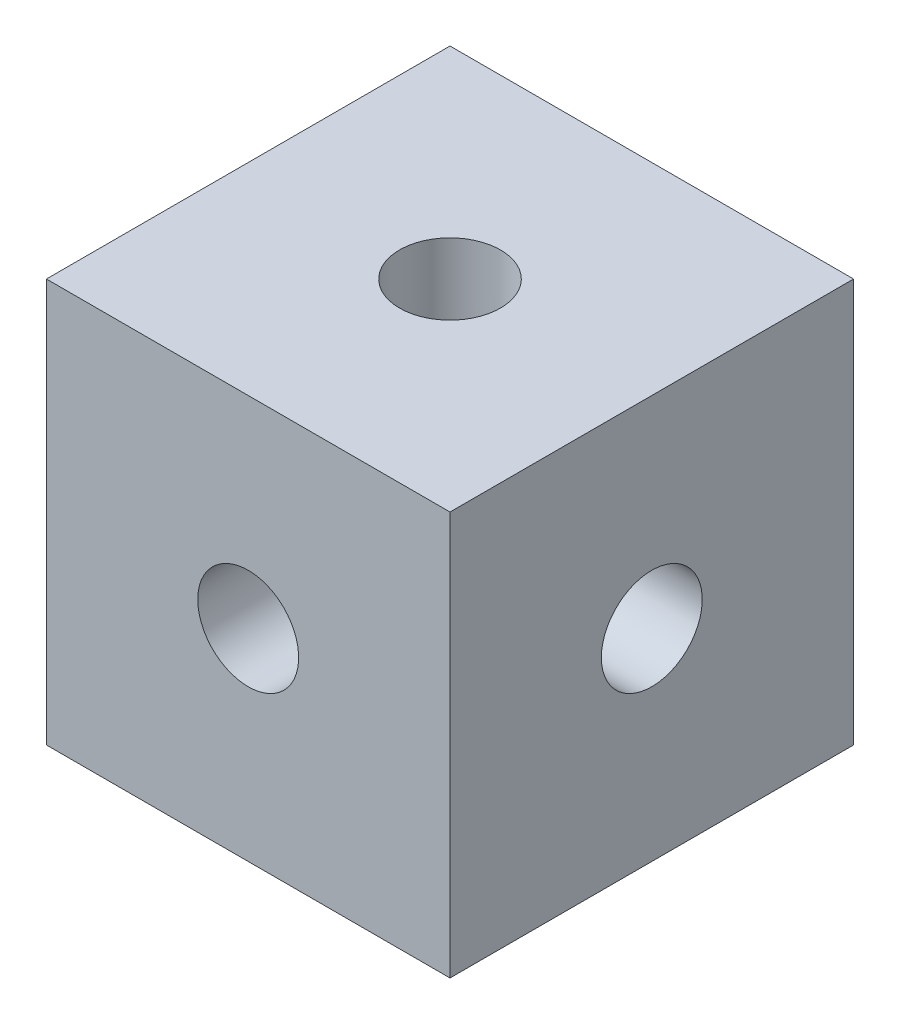
ISO-10303-21;
HEADER;
FILE_DESCRIPTION(('STEP AP214'),'2;1');
FILE_NAME('part.step','',(''),(''),'','','');
FILE_SCHEMA(('AUTOMOTIVE_DESIGN { 1 0 10303 214 1 1 1 1 }'));
ENDSEC;
DATA;
#1=APPLICATION_CONTEXT('core data for automotive mechanical design processes');
#2=APPLICATION_PROTOCOL_DEFINITION('international standard','automotive_design',2000,#1);
#3=PRODUCT_CONTEXT('',#1,'mechanical');
#4=PRODUCT('Part','Part','',(#3));
#5=PRODUCT_RELATED_PRODUCT_CATEGORY('part','',(#4));
#6=PRODUCT_DEFINITION_FORMATION('','',#4);
#7=PRODUCT_DEFINITION_CONTEXT('part definition',#1,'design');
#8=PRODUCT_DEFINITION('design','',#6,#7);
#9=PRODUCT_DEFINITION_SHAPE('','',#8);
#10=(LENGTH_UNIT() NAMED_UNIT(*) SI_UNIT(.MILLI.,.METRE.));
#11=(NAMED_UNIT(*) PLANE_ANGLE_UNIT() SI_UNIT($,.RADIAN.));
#12=(NAMED_UNIT(*) SI_UNIT($,.STERADIAN.) SOLID_ANGLE_UNIT());
#13=UNCERTAINTY_MEASURE_WITH_UNIT(LENGTH_MEASURE(1.E-05),#10,'distance_accuracy_value','');
#14=(GEOMETRIC_REPRESENTATION_CONTEXT(3) GLOBAL_UNCERTAINTY_ASSIGNED_CONTEXT((#13)) GLOBAL_UNIT_ASSIGNED_CONTEXT((#10,
#11,#12)) REPRESENTATION_CONTEXT('',''));
#15=CARTESIAN_POINT('',(0.,0.,0.));
#16=DIRECTION('',(0.,0.,1.));
#17=DIRECTION('',(1.,0.,0.));
#18=AXIS2_PLACEMENT_3D('',#15,#16,#17);
#19=CARTESIAN_POINT('',(-12.7,12.7,25.4));
#20=DIRECTION('',(0.,-1.,0.));
#21=DIRECTION('',(0.,0.,-1.));
#22=AXIS2_PLACEMENT_3D('',#19,#20,#21);
#23=PLANE('',#22);
#24=DIRECTION('',(-1.,0.,0.));
#25=VECTOR('',#24,1.);
#26=CARTESIAN_POINT('',(-12.7,12.7,0.));
#27=LINE('',#26,#25);
#28=CARTESIAN_POINT('',(12.7,12.7,0.));
#29=VERTEX_POINT('',#28);
#30=CARTESIAN_POINT('',(-12.7,12.7,0.));
#31=VERTEX_POINT('',#30);
#32=EDGE_CURVE('E188',#29,#31,#27,.T.);
#33=ORIENTED_EDGE('',*,*,#32,.T.);
#34=DIRECTION('',(0.,0.,-1.));
#35=VECTOR('',#34,1.);
#36=CARTESIAN_POINT('',(-12.7,12.7,25.4));
#37=LINE('',#36,#35);
#38=CARTESIAN_POINT('',(-12.7,12.7,25.4));
#39=VERTEX_POINT('',#38);
#40=EDGE_CURVE('E203',#39,#31,#37,.T.);
#41=ORIENTED_EDGE('',*,*,#40,.F.);
#42=DIRECTION('',(-1.,0.,0.));
#43=VECTOR('',#42,1.);
#44=CARTESIAN_POINT('',(-12.7,12.7,25.4));
#45=LINE('',#44,#43);
#46=CARTESIAN_POINT('',(12.7,12.7,25.4));
#47=VERTEX_POINT('',#46);
#48=EDGE_CURVE('E174',#47,#39,#45,.T.);
#49=ORIENTED_EDGE('',*,*,#48,.F.);
#50=DIRECTION('',(0.,0.,-1.));
#51=VECTOR('',#50,1.);
#52=CARTESIAN_POINT('',(12.7,12.7,25.4));
#53=LINE('',#52,#51);
#54=EDGE_CURVE('E131',#47,#29,#53,.T.);
#55=ORIENTED_EDGE('',*,*,#54,.T.);
#56=EDGE_LOOP('',(#33,#41,#49,#55));
#57=FACE_BOUND('',#56,.T.);
#58=CARTESIAN_POINT('',(0.,12.7,12.7));
#59=DIRECTION('',(0.,1.,0.));
#60=DIRECTION('',(0.,0.,1.));
#61=AXIS2_PLACEMENT_3D('',#58,#59,#60);
#62=CIRCLE('',#61,3.17499999999999);
#63=CARTESIAN_POINT('',(0.,12.7,15.875));
#64=VERTEX_POINT('',#63);
#65=EDGE_CURVE('E153',#64,#64,#62,.T.);
#66=ORIENTED_EDGE('',*,*,#65,.F.);
#67=EDGE_LOOP('',(#66));
#68=FACE_BOUND('',#67,.T.);
#69=ADVANCED_FACE('F39',(#57,#68),#23,.F.);
#70=CARTESIAN_POINT('',(0.,0.,0.));
#71=DIRECTION('',(0.,0.,-1.));
#72=DIRECTION('',(-1.,0.,0.));
#73=AXIS2_PLACEMENT_3D('',#70,#71,#72);
#74=CYLINDRICAL_SURFACE('',#73,3.17499999999999);
#75=CARTESIAN_POINT('',(0.,0.,0.));
#76=DIRECTION('',(0.,0.,-1.));
#77=DIRECTION('',(-1.,0.,0.));
#78=AXIS2_PLACEMENT_3D('',#75,#76,#77);
#79=CIRCLE('',#78,3.17499999999999);
#80=CARTESIAN_POINT('',(-3.17499999999999,0.,0.));
#81=VERTEX_POINT('',#80);
#82=EDGE_CURVE('E161',#81,#81,#79,.T.);
#83=ORIENTED_EDGE('',*,*,#82,.T.);
#84=EDGE_LOOP('',(#83));
#85=FACE_BOUND('',#84,.T.);
#86=CARTESIAN_POINT('',(0.,0.,12.7));
#87=DIRECTION('',(0.,0.707106781186547,-0.707106781186547));
#88=DIRECTION('',(0.,-0.707106781186547,-0.707106781186547));
#89=AXIS2_PLACEMENT_3D('',#86,#87,#88);
#90=ELLIPSE('',#89,4.49012806053456,3.17499999999999);
#91=CARTESIAN_POINT('',(-2.24506403026728,-2.24506403026728,10.4549359697327));
#92=VERTEX_POINT('',#91);
#93=CARTESIAN_POINT('',(2.24506403026728,-2.24506403026728,10.4549359697327));
#94=VERTEX_POINT('',#93);
#95=EDGE_CURVE('E109',#92,#94,#90,.F.);
#96=ORIENTED_EDGE('',*,*,#95,.T.);
#97=CARTESIAN_POINT('',(0.,0.,12.7));
#98=DIRECTION('',(-0.707106781186547,0.,-0.707106781186547));
#99=DIRECTION('',(0.707106781186547,0.,-0.707106781186547));
#100=AXIS2_PLACEMENT_3D('',#97,#98,#99);
#101=ELLIPSE('',#100,4.49012806053456,3.17499999999999);
#102=CARTESIAN_POINT('',(2.24506403026728,2.24506403026728,10.4549359697327));
#103=VERTEX_POINT('',#102);
#104=EDGE_CURVE('E55',#94,#103,#101,.F.);
#105=ORIENTED_EDGE('',*,*,#104,.T.);
#106=CARTESIAN_POINT('',(0.,0.,12.7));
#107=DIRECTION('',(0.,-0.707106781186547,-0.707106781186547));
#108=DIRECTION('',(0.,0.707106781186547,-0.707106781186547));
#109=AXIS2_PLACEMENT_3D('',#106,#107,#108);
#110=ELLIPSE('',#109,4.49012806053456,3.17499999999999);
#111=CARTESIAN_POINT('',(-2.24506403026728,2.24506403026728,10.4549359697327));
#112=VERTEX_POINT('',#111);
#113=EDGE_CURVE('E125',#103,#112,#110,.F.);
#114=ORIENTED_EDGE('',*,*,#113,.T.);
#115=CARTESIAN_POINT('',(0.,0.,12.7));
#116=DIRECTION('',(0.707106781186547,0.,-0.707106781186547));
#117=DIRECTION('',(-0.707106781186547,0.,-0.707106781186547));
#118=AXIS2_PLACEMENT_3D('',#115,#116,#117);
#119=ELLIPSE('',#118,4.49012806053456,3.17499999999999);
#120=EDGE_CURVE('E139',#112,#92,#119,.F.);
#121=ORIENTED_EDGE('',*,*,#120,.T.);
#122=EDGE_LOOP('',(#96,#105,#114,#121));
#123=FACE_BOUND('',#122,.T.);
#124=ADVANCED_FACE('F137',(#85,#123),#74,.F.);
#125=CARTESIAN_POINT('',(12.7,-12.7,25.4));
#126=DIRECTION('',(-1.,0.,0.));
#127=DIRECTION('',(0.,0.,1.));
#128=AXIS2_PLACEMENT_3D('',#125,#126,#127);
#129=PLANE('',#128);
#130=CARTESIAN_POINT('',(12.7,0.,12.7));
#131=DIRECTION('',(-1.,0.,0.));
#132=DIRECTION('',(0.,0.,1.));
#133=AXIS2_PLACEMENT_3D('',#130,#131,#132);
#134=CIRCLE('',#133,3.17499999999999);
#135=CARTESIAN_POINT('',(12.7,0.,15.875));
#136=VERTEX_POINT('',#135);
#137=EDGE_CURVE('E121',#136,#136,#134,.T.);
#138=ORIENTED_EDGE('',*,*,#137,.T.);
#139=EDGE_LOOP('',(#138));
#140=FACE_BOUND('',#139,.T.);
#141=DIRECTION('',(0.,1.,0.));
#142=VECTOR('',#141,1.);
#143=CARTESIAN_POINT('',(12.7,-12.7,0.));
#144=LINE('',#143,#142);
#145=CARTESIAN_POINT('',(12.7,-12.7,0.));
#146=VERTEX_POINT('',#145);
#147=EDGE_CURVE('E169',#146,#29,#144,.T.);
#148=ORIENTED_EDGE('',*,*,#147,.T.);
#149=ORIENTED_EDGE('',*,*,#54,.F.);
#150=DIRECTION('',(0.,1.,0.));
#151=VECTOR('',#150,1.);
#152=CARTESIAN_POINT('',(12.7,-12.7,25.4));
#153=LINE('',#152,#151);
#154=CARTESIAN_POINT('',(12.7,-12.7,25.4));
#155=VERTEX_POINT('',#154);
#156=EDGE_CURVE('E170',#155,#47,#153,.T.);
#157=ORIENTED_EDGE('',*,*,#156,.F.);
#158=DIRECTION('',(0.,0.,-1.));
#159=VECTOR('',#158,1.);
#160=CARTESIAN_POINT('',(12.7,-12.7,25.4));
#161=LINE('',#160,#159);
#162=EDGE_CURVE('E184',#155,#146,#161,.T.);
#163=ORIENTED_EDGE('',*,*,#162,.T.);
#164=EDGE_LOOP('',(#148,#149,#157,#163));
#165=FACE_BOUND('',#164,.T.);
#166=ADVANCED_FACE('F41',(#140,#165),#129,.F.);
#167=CARTESIAN_POINT('',(-12.7,-12.7,25.4));
#168=DIRECTION('',(1.,0.,0.));
#169=DIRECTION('',(0.,0.,-1.));
#170=AXIS2_PLACEMENT_3D('',#167,#168,#169);
#171=PLANE('',#170);
#172=CARTESIAN_POINT('',(-12.7,0.,12.7));
#173=DIRECTION('',(-1.,0.,0.));
#174=DIRECTION('',(0.,0.,1.));
#175=AXIS2_PLACEMENT_3D('',#172,#173,#174);
#176=CIRCLE('',#175,3.17499999999999);
#177=CARTESIAN_POINT('',(-12.7,0.,15.875));
#178=VERTEX_POINT('',#177);
#179=EDGE_CURVE('E255',#178,#178,#176,.T.);
#180=ORIENTED_EDGE('',*,*,#179,.F.);
#181=EDGE_LOOP('',(#180));
#182=FACE_BOUND('',#181,.T.);
#183=DIRECTION('',(0.,-1.,0.));
#184=VECTOR('',#183,1.);
#185=CARTESIAN_POINT('',(-12.7,-12.7,0.));
#186=LINE('',#185,#184);
#187=CARTESIAN_POINT('',(-12.7,-12.7,0.));
#188=VERTEX_POINT('',#187);
#189=EDGE_CURVE('E191',#31,#188,#186,.T.);
#190=ORIENTED_EDGE('',*,*,#189,.T.);
#191=DIRECTION('',(0.,0.,-1.));
#192=VECTOR('',#191,1.);
#193=CARTESIAN_POINT('',(-12.7,-12.7,25.4));
#194=LINE('',#193,#192);
#195=CARTESIAN_POINT('',(-12.7,-12.7,25.4));
#196=VERTEX_POINT('',#195);
#197=EDGE_CURVE('E199',#196,#188,#194,.T.);
#198=ORIENTED_EDGE('',*,*,#197,.F.);
#199=DIRECTION('',(0.,-1.,0.));
#200=VECTOR('',#199,1.);
#201=CARTESIAN_POINT('',(-12.7,-12.7,25.4));
#202=LINE('',#201,#200);
#203=EDGE_CURVE('E178',#39,#196,#202,.T.);
#204=ORIENTED_EDGE('',*,*,#203,.F.);
#205=ORIENTED_EDGE('',*,*,#40,.T.);
#206=EDGE_LOOP('',(#190,#198,#204,#205));
#207=FACE_BOUND('',#206,.T.);
#208=ADVANCED_FACE('F222',(#182,#207),#171,.F.);
#209=CARTESIAN_POINT('',(-12.7,-12.7,25.4));
#210=DIRECTION('',(0.,1.,0.));
#211=DIRECTION('',(0.,0.,1.));
#212=AXIS2_PLACEMENT_3D('',#209,#210,#211);
#213=PLANE('',#212);
#214=CARTESIAN_POINT('',(0.,-12.7,12.7));
#215=DIRECTION('',(0.,1.,0.));
#216=DIRECTION('',(0.,0.,1.));
#217=AXIS2_PLACEMENT_3D('',#214,#215,#216);
#218=CIRCLE('',#217,3.17499999999999);
#219=CARTESIAN_POINT('',(0.,-12.7,15.875));
#220=VERTEX_POINT('',#219);
#221=EDGE_CURVE('E157',#220,#220,#218,.T.);
#222=ORIENTED_EDGE('',*,*,#221,.T.);
#223=EDGE_LOOP('',(#222));
#224=FACE_BOUND('',#223,.T.);
#225=DIRECTION('',(1.,0.,0.));
#226=VECTOR('',#225,1.);
#227=CARTESIAN_POINT('',(-12.7,-12.7,0.));
#228=LINE('',#227,#226);
#229=EDGE_CURVE('E175',#188,#146,#228,.T.);
#230=ORIENTED_EDGE('',*,*,#229,.T.);
#231=ORIENTED_EDGE('',*,*,#162,.F.);
#232=DIRECTION('',(1.,0.,0.));
#233=VECTOR('',#232,1.);
#234=CARTESIAN_POINT('',(-12.7,-12.7,25.4));
#235=LINE('',#234,#233);
#236=EDGE_CURVE('E181',#196,#155,#235,.T.);
#237=ORIENTED_EDGE('',*,*,#236,.F.);
#238=ORIENTED_EDGE('',*,*,#197,.T.);
#239=EDGE_LOOP('',(#230,#231,#237,#238));
#240=FACE_BOUND('',#239,.T.);
#241=ADVANCED_FACE('F226',(#224,#240),#213,.F.);
#242=CARTESIAN_POINT('',(0.,0.,25.4));
#243=DIRECTION('',(0.,0.,-1.));
#244=DIRECTION('',(-1.,0.,0.));
#245=AXIS2_PLACEMENT_3D('',#242,#243,#244);
#246=PLANE('',#245);
#247=CARTESIAN_POINT('',(0.,0.,25.4));
#248=DIRECTION('',(0.,0.,-1.));
#249=DIRECTION('',(-1.,0.,0.));
#250=AXIS2_PLACEMENT_3D('',#247,#248,#249);
#251=CIRCLE('',#250,3.17499999999999);
#252=CARTESIAN_POINT('',(-3.17499999999999,0.,25.4));
#253=VERTEX_POINT('',#252);
#254=EDGE_CURVE('E165',#253,#253,#251,.T.);
#255=ORIENTED_EDGE('',*,*,#254,.T.);
#256=EDGE_LOOP('',(#255));
#257=FACE_BOUND('',#256,.T.);
#258=ORIENTED_EDGE('',*,*,#156,.T.);
#259=ORIENTED_EDGE('',*,*,#48,.T.);
#260=ORIENTED_EDGE('',*,*,#203,.T.);
#261=ORIENTED_EDGE('',*,*,#236,.T.);
#262=EDGE_LOOP('',(#258,#259,#260,#261));
#263=FACE_BOUND('',#262,.T.);
#264=ADVANCED_FACE('F228',(#257,#263),#246,.F.);
#265=CARTESIAN_POINT('',(0.,0.,0.));
#266=DIRECTION('',(0.,0.,-1.));
#267=DIRECTION('',(-1.,0.,0.));
#268=AXIS2_PLACEMENT_3D('',#265,#266,#267);
#269=PLANE('',#268);
#270=ORIENTED_EDGE('',*,*,#82,.F.);
#271=EDGE_LOOP('',(#270));
#272=FACE_BOUND('',#271,.T.);
#273=ORIENTED_EDGE('',*,*,#147,.F.);
#274=ORIENTED_EDGE('',*,*,#229,.F.);
#275=ORIENTED_EDGE('',*,*,#189,.F.);
#276=ORIENTED_EDGE('',*,*,#32,.F.);
#277=EDGE_LOOP('',(#273,#274,#275,#276));
#278=FACE_BOUND('',#277,.T.);
#279=ADVANCED_FACE('F218',(#272,#278),#269,.T.);
#280=CARTESIAN_POINT('',(0.,0.,12.7));
#281=DIRECTION('',(0.,-0.707106781186547,-0.707106781186547));
#282=DIRECTION('',(0.,0.707106781186547,-0.707106781186547));
#283=AXIS2_PLACEMENT_3D('',#280,#281,#282);
#284=ELLIPSE('',#283,4.49012806053456,3.17499999999999);
#285=CARTESIAN_POINT('',(2.24506403026728,-2.24506403026728,14.9450640302673));
#286=VERTEX_POINT('',#285);
#287=CARTESIAN_POINT('',(-2.24506403026728,-2.24506403026728,14.9450640302673));
#288=VERTEX_POINT('',#287);
#289=EDGE_CURVE('E116',#286,#288,#284,.T.);
#290=ORIENTED_EDGE('',*,*,#289,.T.);
#291=CARTESIAN_POINT('',(0.,0.,12.7));
#292=DIRECTION('',(-0.707106781186547,0.,-0.707106781186547));
#293=DIRECTION('',(0.707106781186547,0.,-0.707106781186547));
#294=AXIS2_PLACEMENT_3D('',#291,#292,#293);
#295=ELLIPSE('',#294,4.49012806053456,3.17499999999999);
#296=CARTESIAN_POINT('',(-2.24506403026728,2.24506403026728,14.9450640302673));
#297=VERTEX_POINT('',#296);
#298=EDGE_CURVE('E146',#288,#297,#295,.T.);
#299=ORIENTED_EDGE('',*,*,#298,.T.);
#300=CARTESIAN_POINT('',(0.,0.,12.7));
#301=DIRECTION('',(0.,0.707106781186547,-0.707106781186547));
#302=DIRECTION('',(0.,-0.707106781186547,-0.707106781186547));
#303=AXIS2_PLACEMENT_3D('',#300,#301,#302);
#304=ELLIPSE('',#303,4.49012806053456,3.17499999999999);
#305=CARTESIAN_POINT('',(2.24506403026728,2.24506403026728,14.9450640302673));
#306=VERTEX_POINT('',#305);
#307=EDGE_CURVE('E118',#297,#306,#304,.T.);
#308=ORIENTED_EDGE('',*,*,#307,.T.);
#309=CARTESIAN_POINT('',(0.,0.,12.7));
#310=DIRECTION('',(0.707106781186547,0.,-0.707106781186547));
#311=DIRECTION('',(-0.707106781186547,0.,-0.707106781186547));
#312=AXIS2_PLACEMENT_3D('',#309,#310,#311);
#313=ELLIPSE('',#312,4.49012806053456,3.17499999999999);
#314=EDGE_CURVE('E102',#306,#286,#313,.T.);
#315=ORIENTED_EDGE('',*,*,#314,.T.);
#316=EDGE_LOOP('',(#290,#299,#308,#315));
#317=FACE_BOUND('',#316,.T.);
#318=ORIENTED_EDGE('',*,*,#254,.F.);
#319=EDGE_LOOP('',(#318));
#320=FACE_BOUND('',#319,.T.);
#321=ADVANCED_FACE('F113',(#317,#320),#74,.F.);
#322=CARTESIAN_POINT('',(0.,12.7,12.7));
#323=DIRECTION('',(0.,1.,0.));
#324=DIRECTION('',(0.,0.,1.));
#325=AXIS2_PLACEMENT_3D('',#322,#323,#324);
#326=CYLINDRICAL_SURFACE('',#325,3.17499999999999);
#327=ORIENTED_EDGE('',*,*,#65,.T.);
#328=EDGE_LOOP('',(#327));
#329=FACE_BOUND('',#328,.T.);
#330=ORIENTED_EDGE('',*,*,#113,.F.);
#331=CARTESIAN_POINT('',(0.,0.,12.7));
#332=DIRECTION('',(-0.707106781186547,0.707106781186547,0.));
#333=DIRECTION('',(0.707106781186547,0.707106781186547,0.));
#334=AXIS2_PLACEMENT_3D('',#331,#332,#333);
#335=ELLIPSE('',#334,4.49012806053456,3.17499999999999);
#336=EDGE_CURVE('E120',#103,#306,#335,.F.);
#337=ORIENTED_EDGE('',*,*,#336,.T.);
#338=ORIENTED_EDGE('',*,*,#307,.F.);
#339=CARTESIAN_POINT('',(0.,0.,12.7));
#340=DIRECTION('',(0.707106781186547,0.707106781186547,0.));
#341=DIRECTION('',(-0.707106781186547,0.707106781186547,0.));
#342=AXIS2_PLACEMENT_3D('',#339,#340,#341);
#343=ELLIPSE('',#342,4.49012806053456,3.17499999999999);
#344=EDGE_CURVE('E142',#297,#112,#343,.F.);
#345=ORIENTED_EDGE('',*,*,#344,.T.);
#346=EDGE_LOOP('',(#330,#337,#338,#345));
#347=FACE_BOUND('',#346,.T.);
#348=ADVANCED_FACE('F264',(#329,#347),#326,.F.);
#349=ORIENTED_EDGE('',*,*,#221,.F.);
#350=EDGE_LOOP('',(#349));
#351=FACE_BOUND('',#350,.T.);
#352=ORIENTED_EDGE('',*,*,#95,.F.);
#353=CARTESIAN_POINT('',(0.,0.,12.7));
#354=DIRECTION('',(-0.707106781186547,0.707106781186547,0.));
#355=DIRECTION('',(0.707106781186547,0.707106781186547,0.));
#356=AXIS2_PLACEMENT_3D('',#353,#354,#355);
#357=ELLIPSE('',#356,4.49012806053456,3.17499999999999);
#358=EDGE_CURVE('E11',#92,#288,#357,.T.);
#359=ORIENTED_EDGE('',*,*,#358,.T.);
#360=ORIENTED_EDGE('',*,*,#289,.F.);
#361=CARTESIAN_POINT('',(0.,0.,12.7));
#362=DIRECTION('',(0.707106781186547,0.707106781186547,0.));
#363=DIRECTION('',(-0.707106781186547,0.707106781186547,0.));
#364=AXIS2_PLACEMENT_3D('',#361,#362,#363);
#365=ELLIPSE('',#364,4.49012806053456,3.17499999999999);
#366=EDGE_CURVE('E48',#286,#94,#365,.T.);
#367=ORIENTED_EDGE('',*,*,#366,.T.);
#368=EDGE_LOOP('',(#352,#359,#360,#367));
#369=FACE_BOUND('',#368,.T.);
#370=ADVANCED_FACE('F123',(#351,#369),#326,.F.);
#371=CARTESIAN_POINT('',(-12.7,0.,12.7));
#372=DIRECTION('',(-1.,0.,0.));
#373=DIRECTION('',(0.,0.,1.));
#374=AXIS2_PLACEMENT_3D('',#371,#372,#373);
#375=CYLINDRICAL_SURFACE('',#374,3.17499999999999);
#376=ORIENTED_EDGE('',*,*,#137,.F.);
#377=EDGE_LOOP('',(#376));
#378=FACE_BOUND('',#377,.T.);
#379=ORIENTED_EDGE('',*,*,#366,.F.);
#380=ORIENTED_EDGE('',*,*,#314,.F.);
#381=ORIENTED_EDGE('',*,*,#336,.F.);
#382=ORIENTED_EDGE('',*,*,#104,.F.);
#383=EDGE_LOOP('',(#379,#380,#381,#382));
#384=FACE_BOUND('',#383,.T.);
#385=ADVANCED_FACE('F101',(#378,#384),#375,.F.);
#386=ORIENTED_EDGE('',*,*,#179,.T.);
#387=EDGE_LOOP('',(#386));
#388=FACE_BOUND('',#387,.T.);
#389=ORIENTED_EDGE('',*,*,#358,.F.);
#390=ORIENTED_EDGE('',*,*,#120,.F.);
#391=ORIENTED_EDGE('',*,*,#344,.F.);
#392=ORIENTED_EDGE('',*,*,#298,.F.);
#393=EDGE_LOOP('',(#389,#390,#391,#392));
#394=FACE_BOUND('',#393,.T.);
#395=ADVANCED_FACE('F265',(#388,#394),#375,.F.);
#396=CLOSED_SHELL('',(#69,#124,#166,#208,#241,#264,#279,#321,#348,#370,#385,#395));
#397=MANIFOLD_SOLID_BREP('B2',#396);
#398=ADVANCED_BREP_SHAPE_REPRESENTATION('',(#18,#397),#14);
#399=SHAPE_DEFINITION_REPRESENTATION(#9,#398);
ENDSEC;
END-ISO-10303-21;
